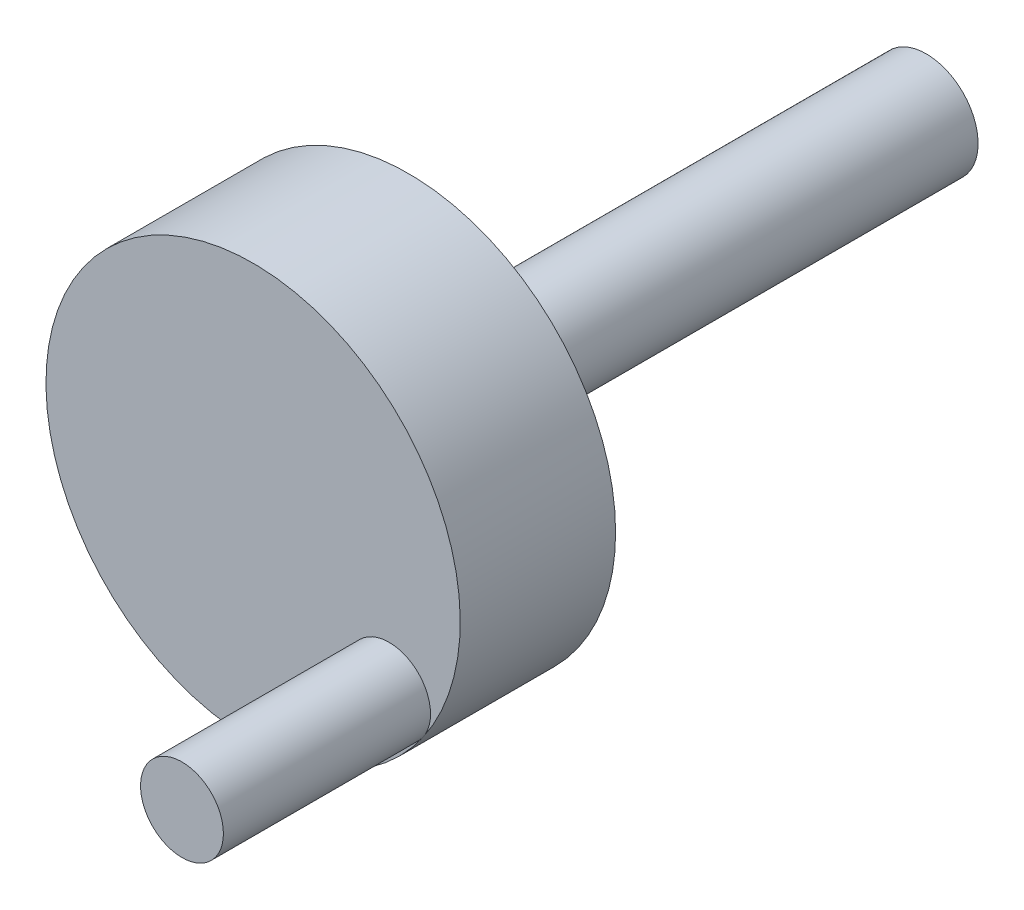
ISO-10303-21;
HEADER;
FILE_DESCRIPTION(('STEP AP214'),'2;1');
FILE_NAME('part.step','',(''),(''),'','','');
FILE_SCHEMA(('AUTOMOTIVE_DESIGN { 1 0 10303 214 1 1 1 1 }'));
ENDSEC;
DATA;
#1=APPLICATION_CONTEXT('core data for automotive mechanical design processes');
#2=APPLICATION_PROTOCOL_DEFINITION('international standard','automotive_design',2000,#1);
#3=PRODUCT_CONTEXT('',#1,'mechanical');
#4=PRODUCT('Part','Part','',(#3));
#5=PRODUCT_RELATED_PRODUCT_CATEGORY('part','',(#4));
#6=PRODUCT_DEFINITION_FORMATION('','',#4);
#7=PRODUCT_DEFINITION_CONTEXT('part definition',#1,'design');
#8=PRODUCT_DEFINITION('design','',#6,#7);
#9=PRODUCT_DEFINITION_SHAPE('','',#8);
#10=(LENGTH_UNIT() NAMED_UNIT(*) SI_UNIT(.MILLI.,.METRE.));
#11=(NAMED_UNIT(*) PLANE_ANGLE_UNIT() SI_UNIT($,.RADIAN.));
#12=(NAMED_UNIT(*) SI_UNIT($,.STERADIAN.) SOLID_ANGLE_UNIT());
#13=UNCERTAINTY_MEASURE_WITH_UNIT(LENGTH_MEASURE(1.E-05),#10,'distance_accuracy_value','');
#14=(GEOMETRIC_REPRESENTATION_CONTEXT(3) GLOBAL_UNCERTAINTY_ASSIGNED_CONTEXT((#13)) GLOBAL_UNIT_ASSIGNED_CONTEXT((#10,
#11,#12)) REPRESENTATION_CONTEXT('',''));
#15=CARTESIAN_POINT('',(0.,0.,0.));
#16=DIRECTION('',(0.,0.,1.));
#17=DIRECTION('',(1.,0.,0.));
#18=AXIS2_PLACEMENT_3D('',#15,#16,#17);
#19=CARTESIAN_POINT('',(0.,0.,15.));
#20=DIRECTION('',(0.,0.,-1.));
#21=DIRECTION('',(-1.,0.,0.));
#22=AXIS2_PLACEMENT_3D('',#19,#20,#21);
#23=CYLINDRICAL_SURFACE('',#22,20.);
#24=CARTESIAN_POINT('',(0.,0.,15.));
#25=DIRECTION('',(0.,0.,1.));
#26=DIRECTION('',(1.,0.,0.));
#27=AXIS2_PLACEMENT_3D('',#24,#25,#26);
#28=CIRCLE('',#27,20.);
#29=CARTESIAN_POINT('',(16.4155816371734,-11.4249148580327,15.));
#30=VERTEX_POINT('',#29);
#31=EDGE_CURVE('E44',#30,#30,#28,.T.);
#32=ORIENTED_EDGE('',*,*,#31,.F.);
#33=EDGE_LOOP('',(#32));
#34=FACE_BOUND('',#33,.T.);
#35=CARTESIAN_POINT('',(0.,0.,0.));
#36=DIRECTION('',(0.,0.,1.));
#37=DIRECTION('',(1.,0.,0.));
#38=AXIS2_PLACEMENT_3D('',#35,#36,#37);
#39=CIRCLE('',#38,20.);
#40=CARTESIAN_POINT('',(20.,0.,0.));
#41=VERTEX_POINT('',#40);
#42=EDGE_CURVE('E40',#41,#41,#39,.T.);
#43=ORIENTED_EDGE('',*,*,#42,.T.);
#44=EDGE_LOOP('',(#43));
#45=FACE_BOUND('',#44,.T.);
#46=ADVANCED_FACE('F37',(#34,#45),#23,.T.);
#47=CARTESIAN_POINT('',(0.,0.,15.));
#48=DIRECTION('',(0.,0.,1.));
#49=DIRECTION('',(1.,0.,0.));
#50=AXIS2_PLACEMENT_3D('',#47,#48,#49);
#51=PLANE('',#50);
#52=ORIENTED_EDGE('',*,*,#31,.T.);
#53=CARTESIAN_POINT('',(13.1324653097387,-9.13993188642613,15.));
#54=DIRECTION('',(0.,0.,1.));
#55=DIRECTION('',(1.,0.,0.));
#56=AXIS2_PLACEMENT_3D('',#53,#54,#55);
#57=CIRCLE('',#56,4.);
#58=EDGE_CURVE('E55',#30,#30,#57,.T.);
#59=ORIENTED_EDGE('',*,*,#58,.F.);
#60=EDGE_LOOP('',(#52,#59));
#61=FACE_BOUND('',#60,.T.);
#62=ADVANCED_FACE('F77',(#61),#51,.T.);
#63=CARTESIAN_POINT('',(0.,0.,0.));
#64=DIRECTION('',(0.,0.,1.));
#65=DIRECTION('',(1.,0.,0.));
#66=AXIS2_PLACEMENT_3D('',#63,#64,#65);
#67=PLANE('',#66);
#68=CARTESIAN_POINT('',(0.,0.,0.));
#69=DIRECTION('',(0.,0.,-1.));
#70=DIRECTION('',(-1.,0.,0.));
#71=AXIS2_PLACEMENT_3D('',#68,#69,#70);
#72=CIRCLE('',#71,5.);
#73=CARTESIAN_POINT('',(-5.,0.,0.));
#74=VERTEX_POINT('',#73);
#75=EDGE_CURVE('E11',#74,#74,#72,.T.);
#76=ORIENTED_EDGE('',*,*,#75,.F.);
#77=EDGE_LOOP('',(#76));
#78=FACE_BOUND('',#77,.T.);
#79=ORIENTED_EDGE('',*,*,#42,.F.);
#80=EDGE_LOOP('',(#79));
#81=FACE_BOUND('',#80,.T.);
#82=ADVANCED_FACE('F73',(#78,#81),#67,.F.);
#83=CARTESIAN_POINT('',(13.1324653097387,-9.13993188642613,35.));
#84=DIRECTION('',(0.,0.,-1.));
#85=DIRECTION('',(-1.,0.,0.));
#86=AXIS2_PLACEMENT_3D('',#83,#84,#85);
#87=CYLINDRICAL_SURFACE('',#86,4.);
#88=CARTESIAN_POINT('',(13.1324653097387,-9.13993188642613,35.));
#89=DIRECTION('',(0.,0.,1.));
#90=DIRECTION('',(1.,0.,0.));
#91=AXIS2_PLACEMENT_3D('',#88,#89,#90);
#92=CIRCLE('',#91,4.);
#93=CARTESIAN_POINT('',(17.1324653097387,-9.13993188642613,35.));
#94=VERTEX_POINT('',#93);
#95=EDGE_CURVE('E53',#94,#94,#92,.T.);
#96=ORIENTED_EDGE('',*,*,#95,.F.);
#97=EDGE_LOOP('',(#96));
#98=FACE_BOUND('',#97,.T.);
#99=ORIENTED_EDGE('',*,*,#58,.T.);
#100=EDGE_LOOP('',(#99));
#101=FACE_BOUND('',#100,.T.);
#102=ADVANCED_FACE('F76',(#98,#101),#87,.T.);
#103=CARTESIAN_POINT('',(13.1324653097387,-9.13993188642613,35.));
#104=DIRECTION('',(0.,0.,1.));
#105=DIRECTION('',(1.,0.,0.));
#106=AXIS2_PLACEMENT_3D('',#103,#104,#105);
#107=PLANE('',#106);
#108=ORIENTED_EDGE('',*,*,#95,.T.);
#109=EDGE_LOOP('',(#108));
#110=FACE_BOUND('',#109,.T.);
#111=ADVANCED_FACE('F69',(#110),#107,.T.);
#112=CARTESIAN_POINT('',(0.,0.,-50.));
#113=DIRECTION('',(0.,0.,1.));
#114=DIRECTION('',(1.,0.,0.));
#115=AXIS2_PLACEMENT_3D('',#112,#113,#114);
#116=CYLINDRICAL_SURFACE('',#115,5.);
#117=CARTESIAN_POINT('',(0.,0.,-50.));
#118=DIRECTION('',(0.,0.,-1.));
#119=DIRECTION('',(-1.,0.,0.));
#120=AXIS2_PLACEMENT_3D('',#117,#118,#119);
#121=CIRCLE('',#120,5.);
#122=CARTESIAN_POINT('',(-5.,0.,-50.));
#123=VERTEX_POINT('',#122);
#124=EDGE_CURVE('E58',#123,#123,#121,.T.);
#125=ORIENTED_EDGE('',*,*,#124,.F.);
#126=EDGE_LOOP('',(#125));
#127=FACE_BOUND('',#126,.T.);
#128=ORIENTED_EDGE('',*,*,#75,.T.);
#129=EDGE_LOOP('',(#128));
#130=FACE_BOUND('',#129,.T.);
#131=ADVANCED_FACE('F66',(#127,#130),#116,.T.);
#132=CARTESIAN_POINT('',(0.,0.,-50.));
#133=DIRECTION('',(0.,0.,-1.));
#134=DIRECTION('',(-1.,0.,0.));
#135=AXIS2_PLACEMENT_3D('',#132,#133,#134);
#136=PLANE('',#135);
#137=ORIENTED_EDGE('',*,*,#124,.T.);
#138=EDGE_LOOP('',(#137));
#139=FACE_BOUND('',#138,.T.);
#140=ADVANCED_FACE('F64',(#139),#136,.T.);
#141=CLOSED_SHELL('',(#46,#62,#82,#102,#111,#131,#140));
#142=MANIFOLD_SOLID_BREP('B2',#141);
#143=ADVANCED_BREP_SHAPE_REPRESENTATION('',(#18,#142),#14);
#144=SHAPE_DEFINITION_REPRESENTATION(#9,#143);
ENDSEC;
END-ISO-10303-21;
